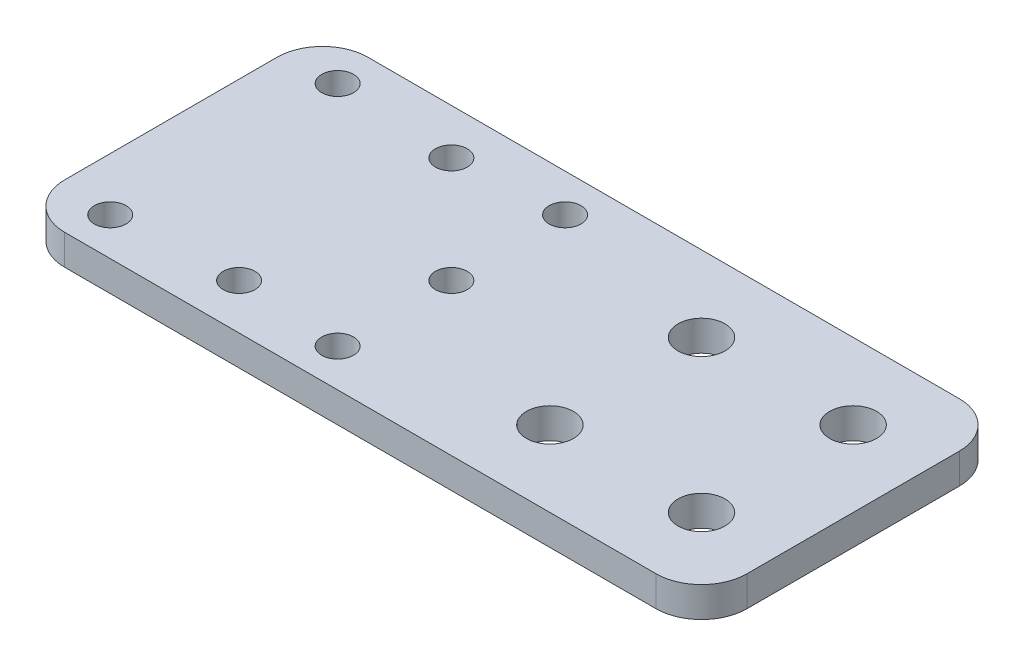
ISO-10303-21;
HEADER;
FILE_DESCRIPTION(('STEP AP214'),'2;1');
FILE_NAME('part.step','',(''),(''),'','','');
FILE_SCHEMA(('AUTOMOTIVE_DESIGN { 1 0 10303 214 1 1 1 1 }'));
ENDSEC;
DATA;
#1=APPLICATION_CONTEXT('core data for automotive mechanical design processes');
#2=APPLICATION_PROTOCOL_DEFINITION('international standard','automotive_design',2000,#1);
#3=PRODUCT_CONTEXT('',#1,'mechanical');
#4=PRODUCT('Part','Part','',(#3));
#5=PRODUCT_RELATED_PRODUCT_CATEGORY('part','',(#4));
#6=PRODUCT_DEFINITION_FORMATION('','',#4);
#7=PRODUCT_DEFINITION_CONTEXT('part definition',#1,'design');
#8=PRODUCT_DEFINITION('design','',#6,#7);
#9=PRODUCT_DEFINITION_SHAPE('','',#8);
#10=(LENGTH_UNIT() NAMED_UNIT(*) SI_UNIT(.MILLI.,.METRE.));
#11=(NAMED_UNIT(*) PLANE_ANGLE_UNIT() SI_UNIT($,.RADIAN.));
#12=(NAMED_UNIT(*) SI_UNIT($,.STERADIAN.) SOLID_ANGLE_UNIT());
#13=UNCERTAINTY_MEASURE_WITH_UNIT(LENGTH_MEASURE(1.E-05),#10,'distance_accuracy_value','');
#14=(GEOMETRIC_REPRESENTATION_CONTEXT(3) GLOBAL_UNCERTAINTY_ASSIGNED_CONTEXT((#13)) GLOBAL_UNIT_ASSIGNED_CONTEXT((#10,
#11,#12)) REPRESENTATION_CONTEXT('',''));
#15=CARTESIAN_POINT('',(0.,0.,0.));
#16=DIRECTION('',(0.,0.,1.));
#17=DIRECTION('',(1.,0.,0.));
#18=AXIS2_PLACEMENT_3D('',#15,#16,#17);
#19=CARTESIAN_POINT('',(0.,2.,0.));
#20=DIRECTION('',(0.,-1.,0.));
#21=DIRECTION('',(0.,0.,-1.));
#22=AXIS2_PLACEMENT_3D('',#19,#20,#21);
#23=PLANE('',#22);
#24=DIRECTION('',(-1.,0.,0.));
#25=VECTOR('',#24,1.);
#26=CARTESIAN_POINT('',(0.,2.,-20.));
#27=LINE('',#26,#25);
#28=CARTESIAN_POINT('',(42.,2.,-20.));
#29=VERTEX_POINT('',#28);
#30=CARTESIAN_POINT('',(3.,2.,-20.));
#31=VERTEX_POINT('',#30);
#32=EDGE_CURVE('E154',#29,#31,#27,.T.);
#33=ORIENTED_EDGE('',*,*,#32,.T.);
#34=CARTESIAN_POINT('',(3.,2.,-17.));
#35=DIRECTION('',(0.,-1.,0.));
#36=DIRECTION('',(0.,0.,-1.));
#37=AXIS2_PLACEMENT_3D('',#34,#35,#36);
#38=CIRCLE('',#37,3.);
#39=CARTESIAN_POINT('',(0.,2.,-17.));
#40=VERTEX_POINT('',#39);
#41=EDGE_CURVE('E184',#31,#40,#38,.F.);
#42=ORIENTED_EDGE('',*,*,#41,.T.);
#43=DIRECTION('',(0.,0.,1.));
#44=VECTOR('',#43,1.);
#45=CARTESIAN_POINT('',(0.,2.,0.));
#46=LINE('',#45,#44);
#47=CARTESIAN_POINT('',(0.,2.,-3.));
#48=VERTEX_POINT('',#47);
#49=EDGE_CURVE('E133',#40,#48,#46,.T.);
#50=ORIENTED_EDGE('',*,*,#49,.T.);
#51=CARTESIAN_POINT('',(3.,2.,-3.));
#52=DIRECTION('',(0.,-1.,0.));
#53=DIRECTION('',(0.,0.,-1.));
#54=AXIS2_PLACEMENT_3D('',#51,#52,#53);
#55=CIRCLE('',#54,3.);
#56=CARTESIAN_POINT('',(3.,2.,0.));
#57=VERTEX_POINT('',#56);
#58=EDGE_CURVE('E176',#48,#57,#55,.F.);
#59=ORIENTED_EDGE('',*,*,#58,.T.);
#60=DIRECTION('',(1.,0.,0.));
#61=VECTOR('',#60,1.);
#62=CARTESIAN_POINT('',(0.,2.,0.));
#63=LINE('',#62,#61);
#64=CARTESIAN_POINT('',(42.,2.,0.));
#65=VERTEX_POINT('',#64);
#66=EDGE_CURVE('E199',#57,#65,#63,.T.);
#67=ORIENTED_EDGE('',*,*,#66,.T.);
#68=CARTESIAN_POINT('',(42.,2.,-3.00000000000001));
#69=DIRECTION('',(0.,-1.,0.));
#70=DIRECTION('',(0.,0.,-1.));
#71=AXIS2_PLACEMENT_3D('',#68,#69,#70);
#72=CIRCLE('',#71,3.);
#73=CARTESIAN_POINT('',(45.,2.,-3.00000000000001));
#74=VERTEX_POINT('',#73);
#75=EDGE_CURVE('E68',#65,#74,#72,.F.);
#76=ORIENTED_EDGE('',*,*,#75,.T.);
#77=DIRECTION('',(0.,0.,-1.));
#78=VECTOR('',#77,1.);
#79=CARTESIAN_POINT('',(45.,2.,0.));
#80=LINE('',#79,#78);
#81=CARTESIAN_POINT('',(45.,2.,-17.));
#82=VERTEX_POINT('',#81);
#83=EDGE_CURVE('E207',#74,#82,#80,.T.);
#84=ORIENTED_EDGE('',*,*,#83,.T.);
#85=CARTESIAN_POINT('',(42.,2.,-17.));
#86=DIRECTION('',(0.,-1.,0.));
#87=DIRECTION('',(0.,0.,-1.));
#88=AXIS2_PLACEMENT_3D('',#85,#86,#87);
#89=CIRCLE('',#88,3.);
#90=EDGE_CURVE('E181',#82,#29,#89,.F.);
#91=ORIENTED_EDGE('',*,*,#90,.T.);
#92=EDGE_LOOP('',(#33,#42,#50,#59,#67,#76,#84,#91));
#93=FACE_BOUND('',#92,.T.);
#94=CARTESIAN_POINT('',(30.,2.,-15.));
#95=DIRECTION('',(0.,1.,0.));
#96=DIRECTION('',(0.,0.,1.));
#97=AXIS2_PLACEMENT_3D('',#94,#95,#96);
#98=CIRCLE('',#97,1.55);
#99=CARTESIAN_POINT('',(30.,2.,-13.45));
#100=VERTEX_POINT('',#99);
#101=EDGE_CURVE('E143',#100,#100,#98,.T.);
#102=ORIENTED_EDGE('',*,*,#101,.F.);
#103=EDGE_LOOP('',(#102));
#104=FACE_BOUND('',#103,.T.);
#105=CARTESIAN_POINT('',(40.,2.,-15.));
#106=DIRECTION('',(0.,1.,0.));
#107=DIRECTION('',(0.,0.,1.));
#108=AXIS2_PLACEMENT_3D('',#105,#106,#107);
#109=CIRCLE('',#108,1.55);
#110=CARTESIAN_POINT('',(40.,2.,-13.45));
#111=VERTEX_POINT('',#110);
#112=EDGE_CURVE('E219',#111,#111,#109,.T.);
#113=ORIENTED_EDGE('',*,*,#112,.F.);
#114=EDGE_LOOP('',(#113));
#115=FACE_BOUND('',#114,.T.);
#116=CARTESIAN_POINT('',(40.,2.,-5.));
#117=DIRECTION('',(0.,1.,0.));
#118=DIRECTION('',(0.,0.,1.));
#119=AXIS2_PLACEMENT_3D('',#116,#117,#118);
#120=CIRCLE('',#119,1.55);
#121=CARTESIAN_POINT('',(40.,2.,-3.45));
#122=VERTEX_POINT('',#121);
#123=EDGE_CURVE('E225',#122,#122,#120,.T.);
#124=ORIENTED_EDGE('',*,*,#123,.F.);
#125=EDGE_LOOP('',(#124));
#126=FACE_BOUND('',#125,.T.);
#127=CARTESIAN_POINT('',(30.,2.,-5.));
#128=DIRECTION('',(0.,1.,0.));
#129=DIRECTION('',(0.,0.,1.));
#130=AXIS2_PLACEMENT_3D('',#127,#128,#129);
#131=CIRCLE('',#130,1.55);
#132=CARTESIAN_POINT('',(30.,2.,-3.45));
#133=VERTEX_POINT('',#132);
#134=EDGE_CURVE('E233',#133,#133,#131,.T.);
#135=ORIENTED_EDGE('',*,*,#134,.F.);
#136=EDGE_LOOP('',(#135));
#137=FACE_BOUND('',#136,.T.);
#138=CARTESIAN_POINT('',(11.5,2.,-17.));
#139=DIRECTION('',(0.,1.,0.));
#140=DIRECTION('',(0.,0.,1.));
#141=AXIS2_PLACEMENT_3D('',#138,#139,#140);
#142=CIRCLE('',#141,1.05);
#143=CARTESIAN_POINT('',(11.5,2.,-15.95));
#144=VERTEX_POINT('',#143);
#145=EDGE_CURVE('E241',#144,#144,#142,.T.);
#146=ORIENTED_EDGE('',*,*,#145,.F.);
#147=EDGE_LOOP('',(#146));
#148=FACE_BOUND('',#147,.T.);
#149=CARTESIAN_POINT('',(18.5,2.,-10.));
#150=DIRECTION('',(0.,1.,0.));
#151=DIRECTION('',(0.,0.,1.));
#152=AXIS2_PLACEMENT_3D('',#149,#150,#151);
#153=CIRCLE('',#152,1.05);
#154=CARTESIAN_POINT('',(18.5,2.,-8.95));
#155=VERTEX_POINT('',#154);
#156=EDGE_CURVE('E249',#155,#155,#153,.T.);
#157=ORIENTED_EDGE('',*,*,#156,.F.);
#158=EDGE_LOOP('',(#157));
#159=FACE_BOUND('',#158,.T.);
#160=CARTESIAN_POINT('',(11.5,2.,-3.));
#161=DIRECTION('',(0.,1.,0.));
#162=DIRECTION('',(0.,0.,1.));
#163=AXIS2_PLACEMENT_3D('',#160,#161,#162);
#164=CIRCLE('',#163,1.05);
#165=CARTESIAN_POINT('',(11.5,2.,-1.95));
#166=VERTEX_POINT('',#165);
#167=EDGE_CURVE('E257',#166,#166,#164,.T.);
#168=ORIENTED_EDGE('',*,*,#167,.F.);
#169=EDGE_LOOP('',(#168));
#170=FACE_BOUND('',#169,.T.);
#171=CARTESIAN_POINT('',(3.5,2.,-17.5));
#172=DIRECTION('',(0.,1.,0.));
#173=DIRECTION('',(0.,0.,1.));
#174=AXIS2_PLACEMENT_3D('',#171,#172,#173);
#175=CIRCLE('',#174,1.05);
#176=CARTESIAN_POINT('',(3.5,2.,-16.45));
#177=VERTEX_POINT('',#176);
#178=EDGE_CURVE('E265',#177,#177,#175,.T.);
#179=ORIENTED_EDGE('',*,*,#178,.F.);
#180=EDGE_LOOP('',(#179));
#181=FACE_BOUND('',#180,.T.);
#182=CARTESIAN_POINT('',(18.5,2.,-17.5));
#183=DIRECTION('',(0.,1.,0.));
#184=DIRECTION('',(0.,0.,1.));
#185=AXIS2_PLACEMENT_3D('',#182,#183,#184);
#186=CIRCLE('',#185,1.05);
#187=CARTESIAN_POINT('',(18.5,2.,-16.45));
#188=VERTEX_POINT('',#187);
#189=EDGE_CURVE('E273',#188,#188,#186,.T.);
#190=ORIENTED_EDGE('',*,*,#189,.F.);
#191=EDGE_LOOP('',(#190));
#192=FACE_BOUND('',#191,.T.);
#193=CARTESIAN_POINT('',(18.5,2.,-2.5));
#194=DIRECTION('',(0.,1.,0.));
#195=DIRECTION('',(0.,0.,1.));
#196=AXIS2_PLACEMENT_3D('',#193,#194,#195);
#197=CIRCLE('',#196,1.05);
#198=CARTESIAN_POINT('',(18.5,2.,-1.45));
#199=VERTEX_POINT('',#198);
#200=EDGE_CURVE('E281',#199,#199,#197,.T.);
#201=ORIENTED_EDGE('',*,*,#200,.F.);
#202=EDGE_LOOP('',(#201));
#203=FACE_BOUND('',#202,.T.);
#204=CARTESIAN_POINT('',(3.5,2.,-2.5));
#205=DIRECTION('',(0.,1.,0.));
#206=DIRECTION('',(0.,0.,1.));
#207=AXIS2_PLACEMENT_3D('',#204,#205,#206);
#208=CIRCLE('',#207,1.05);
#209=CARTESIAN_POINT('',(3.5,2.,-1.45));
#210=VERTEX_POINT('',#209);
#211=EDGE_CURVE('E289',#210,#210,#208,.T.);
#212=ORIENTED_EDGE('',*,*,#211,.F.);
#213=EDGE_LOOP('',(#212));
#214=FACE_BOUND('',#213,.T.);
#215=ADVANCED_FACE('F45',(#93,#104,#115,#126,#137,#148,#159,#170,#181,#192,#203,#214),#23,.F.);
#216=CARTESIAN_POINT('',(0.,0.,0.));
#217=DIRECTION('',(0.,-1.,0.));
#218=DIRECTION('',(0.,0.,-1.));
#219=AXIS2_PLACEMENT_3D('',#216,#217,#218);
#220=PLANE('',#219);
#221=CARTESIAN_POINT('',(18.5,0.,-2.5));
#222=DIRECTION('',(0.,1.,0.));
#223=DIRECTION('',(0.,0.,1.));
#224=AXIS2_PLACEMENT_3D('',#221,#222,#223);
#225=CIRCLE('',#224,1.05);
#226=CARTESIAN_POINT('',(18.5,0.,-1.45));
#227=VERTEX_POINT('',#226);
#228=EDGE_CURVE('E285',#227,#227,#225,.T.);
#229=ORIENTED_EDGE('',*,*,#228,.T.);
#230=EDGE_LOOP('',(#229));
#231=FACE_BOUND('',#230,.T.);
#232=CARTESIAN_POINT('',(3.5,0.,-17.5));
#233=DIRECTION('',(0.,1.,0.));
#234=DIRECTION('',(0.,0.,1.));
#235=AXIS2_PLACEMENT_3D('',#232,#233,#234);
#236=CIRCLE('',#235,1.05);
#237=CARTESIAN_POINT('',(3.5,0.,-16.45));
#238=VERTEX_POINT('',#237);
#239=EDGE_CURVE('E269',#238,#238,#236,.T.);
#240=ORIENTED_EDGE('',*,*,#239,.T.);
#241=EDGE_LOOP('',(#240));
#242=FACE_BOUND('',#241,.T.);
#243=CARTESIAN_POINT('',(18.5,0.,-10.));
#244=DIRECTION('',(0.,1.,0.));
#245=DIRECTION('',(0.,0.,1.));
#246=AXIS2_PLACEMENT_3D('',#243,#244,#245);
#247=CIRCLE('',#246,1.05);
#248=CARTESIAN_POINT('',(18.5,0.,-8.95));
#249=VERTEX_POINT('',#248);
#250=EDGE_CURVE('E253',#249,#249,#247,.T.);
#251=ORIENTED_EDGE('',*,*,#250,.T.);
#252=EDGE_LOOP('',(#251));
#253=FACE_BOUND('',#252,.T.);
#254=CARTESIAN_POINT('',(30.,0.,-5.));
#255=DIRECTION('',(0.,1.,0.));
#256=DIRECTION('',(0.,0.,1.));
#257=AXIS2_PLACEMENT_3D('',#254,#255,#256);
#258=CIRCLE('',#257,1.55);
#259=CARTESIAN_POINT('',(30.,0.,-3.45));
#260=VERTEX_POINT('',#259);
#261=EDGE_CURVE('E237',#260,#260,#258,.T.);
#262=ORIENTED_EDGE('',*,*,#261,.T.);
#263=EDGE_LOOP('',(#262));
#264=FACE_BOUND('',#263,.T.);
#265=CARTESIAN_POINT('',(40.,0.,-15.));
#266=DIRECTION('',(0.,1.,0.));
#267=DIRECTION('',(0.,0.,1.));
#268=AXIS2_PLACEMENT_3D('',#265,#266,#267);
#269=CIRCLE('',#268,1.55);
#270=CARTESIAN_POINT('',(40.,0.,-13.45));
#271=VERTEX_POINT('',#270);
#272=EDGE_CURVE('E221',#271,#271,#269,.T.);
#273=ORIENTED_EDGE('',*,*,#272,.T.);
#274=EDGE_LOOP('',(#273));
#275=FACE_BOUND('',#274,.T.);
#276=DIRECTION('',(0.,0.,1.));
#277=VECTOR('',#276,1.);
#278=CARTESIAN_POINT('',(0.,0.,0.));
#279=LINE('',#278,#277);
#280=CARTESIAN_POINT('',(0.,0.,-17.));
#281=VERTEX_POINT('',#280);
#282=CARTESIAN_POINT('',(0.,0.,-3.));
#283=VERTEX_POINT('',#282);
#284=EDGE_CURVE('E130',#281,#283,#279,.T.);
#285=ORIENTED_EDGE('',*,*,#284,.F.);
#286=CARTESIAN_POINT('',(3.,0.,-17.));
#287=DIRECTION('',(0.,-1.,0.));
#288=DIRECTION('',(0.,0.,-1.));
#289=AXIS2_PLACEMENT_3D('',#286,#287,#288);
#290=CIRCLE('',#289,3.);
#291=CARTESIAN_POINT('',(3.,0.,-20.));
#292=VERTEX_POINT('',#291);
#293=EDGE_CURVE('E112',#281,#292,#290,.T.);
#294=ORIENTED_EDGE('',*,*,#293,.T.);
#295=DIRECTION('',(-1.,0.,0.));
#296=VECTOR('',#295,1.);
#297=CARTESIAN_POINT('',(0.,0.,-20.));
#298=LINE('',#297,#296);
#299=CARTESIAN_POINT('',(42.,0.,-20.));
#300=VERTEX_POINT('',#299);
#301=EDGE_CURVE('E159',#300,#292,#298,.T.);
#302=ORIENTED_EDGE('',*,*,#301,.F.);
#303=CARTESIAN_POINT('',(42.,0.,-17.));
#304=DIRECTION('',(0.,-1.,0.));
#305=DIRECTION('',(0.,0.,-1.));
#306=AXIS2_PLACEMENT_3D('',#303,#304,#305);
#307=CIRCLE('',#306,3.);
#308=CARTESIAN_POINT('',(45.,0.,-17.));
#309=VERTEX_POINT('',#308);
#310=EDGE_CURVE('E124',#300,#309,#307,.T.);
#311=ORIENTED_EDGE('',*,*,#310,.T.);
#312=DIRECTION('',(0.,0.,-1.));
#313=VECTOR('',#312,1.);
#314=CARTESIAN_POINT('',(45.,0.,0.));
#315=LINE('',#314,#313);
#316=CARTESIAN_POINT('',(45.,0.,-3.00000000000001));
#317=VERTEX_POINT('',#316);
#318=EDGE_CURVE('E148',#317,#309,#315,.T.);
#319=ORIENTED_EDGE('',*,*,#318,.F.);
#320=CARTESIAN_POINT('',(42.,0.,-3.00000000000001));
#321=DIRECTION('',(0.,-1.,0.));
#322=DIRECTION('',(0.,0.,-1.));
#323=AXIS2_PLACEMENT_3D('',#320,#321,#322);
#324=CIRCLE('',#323,3.);
#325=CARTESIAN_POINT('',(42.,0.,0.));
#326=VERTEX_POINT('',#325);
#327=EDGE_CURVE('E166',#317,#326,#324,.T.);
#328=ORIENTED_EDGE('',*,*,#327,.T.);
#329=DIRECTION('',(1.,0.,0.));
#330=VECTOR('',#329,1.);
#331=CARTESIAN_POINT('',(0.,0.,0.));
#332=LINE('',#331,#330);
#333=CARTESIAN_POINT('',(3.,0.,0.));
#334=VERTEX_POINT('',#333);
#335=EDGE_CURVE('E142',#334,#326,#332,.T.);
#336=ORIENTED_EDGE('',*,*,#335,.F.);
#337=CARTESIAN_POINT('',(3.,0.,-3.));
#338=DIRECTION('',(0.,-1.,0.));
#339=DIRECTION('',(0.,0.,-1.));
#340=AXIS2_PLACEMENT_3D('',#337,#338,#339);
#341=CIRCLE('',#340,3.);
#342=EDGE_CURVE('E135',#334,#283,#341,.T.);
#343=ORIENTED_EDGE('',*,*,#342,.T.);
#344=EDGE_LOOP('',(#285,#294,#302,#311,#319,#328,#336,#343));
#345=FACE_BOUND('',#344,.T.);
#346=CARTESIAN_POINT('',(30.,0.,-15.));
#347=DIRECTION('',(0.,1.,0.));
#348=DIRECTION('',(0.,0.,1.));
#349=AXIS2_PLACEMENT_3D('',#346,#347,#348);
#350=CIRCLE('',#349,1.55);
#351=CARTESIAN_POINT('',(30.,0.,-13.45));
#352=VERTEX_POINT('',#351);
#353=EDGE_CURVE('E151',#352,#352,#350,.T.);
#354=ORIENTED_EDGE('',*,*,#353,.T.);
#355=EDGE_LOOP('',(#354));
#356=FACE_BOUND('',#355,.T.);
#357=CARTESIAN_POINT('',(40.,0.,-5.));
#358=DIRECTION('',(0.,1.,0.));
#359=DIRECTION('',(0.,0.,1.));
#360=AXIS2_PLACEMENT_3D('',#357,#358,#359);
#361=CIRCLE('',#360,1.55);
#362=CARTESIAN_POINT('',(40.,0.,-3.45));
#363=VERTEX_POINT('',#362);
#364=EDGE_CURVE('E229',#363,#363,#361,.T.);
#365=ORIENTED_EDGE('',*,*,#364,.T.);
#366=EDGE_LOOP('',(#365));
#367=FACE_BOUND('',#366,.T.);
#368=CARTESIAN_POINT('',(11.5,0.,-17.));
#369=DIRECTION('',(0.,1.,0.));
#370=DIRECTION('',(0.,0.,1.));
#371=AXIS2_PLACEMENT_3D('',#368,#369,#370);
#372=CIRCLE('',#371,1.05);
#373=CARTESIAN_POINT('',(11.5,0.,-15.95));
#374=VERTEX_POINT('',#373);
#375=EDGE_CURVE('E245',#374,#374,#372,.T.);
#376=ORIENTED_EDGE('',*,*,#375,.T.);
#377=EDGE_LOOP('',(#376));
#378=FACE_BOUND('',#377,.T.);
#379=CARTESIAN_POINT('',(11.5,0.,-3.));
#380=DIRECTION('',(0.,1.,0.));
#381=DIRECTION('',(0.,0.,1.));
#382=AXIS2_PLACEMENT_3D('',#379,#380,#381);
#383=CIRCLE('',#382,1.05);
#384=CARTESIAN_POINT('',(11.5,0.,-1.95));
#385=VERTEX_POINT('',#384);
#386=EDGE_CURVE('E261',#385,#385,#383,.T.);
#387=ORIENTED_EDGE('',*,*,#386,.T.);
#388=EDGE_LOOP('',(#387));
#389=FACE_BOUND('',#388,.T.);
#390=CARTESIAN_POINT('',(18.5,0.,-17.5));
#391=DIRECTION('',(0.,1.,0.));
#392=DIRECTION('',(0.,0.,1.));
#393=AXIS2_PLACEMENT_3D('',#390,#391,#392);
#394=CIRCLE('',#393,1.05);
#395=CARTESIAN_POINT('',(18.5,0.,-16.45));
#396=VERTEX_POINT('',#395);
#397=EDGE_CURVE('E277',#396,#396,#394,.T.);
#398=ORIENTED_EDGE('',*,*,#397,.T.);
#399=EDGE_LOOP('',(#398));
#400=FACE_BOUND('',#399,.T.);
#401=CARTESIAN_POINT('',(3.5,0.,-2.5));
#402=DIRECTION('',(0.,1.,0.));
#403=DIRECTION('',(0.,0.,1.));
#404=AXIS2_PLACEMENT_3D('',#401,#402,#403);
#405=CIRCLE('',#404,1.05);
#406=CARTESIAN_POINT('',(3.5,0.,-1.45));
#407=VERTEX_POINT('',#406);
#408=EDGE_CURVE('E293',#407,#407,#405,.T.);
#409=ORIENTED_EDGE('',*,*,#408,.T.);
#410=EDGE_LOOP('',(#409));
#411=FACE_BOUND('',#410,.T.);
#412=ADVANCED_FACE('F138',(#231,#242,#253,#264,#275,#345,#356,#367,#378,#389,#400,#411),#220,.T.);
#413=CARTESIAN_POINT('',(0.,2.,0.));
#414=DIRECTION('',(1.,0.,0.));
#415=DIRECTION('',(0.,0.,-1.));
#416=AXIS2_PLACEMENT_3D('',#413,#414,#415);
#417=PLANE('',#416);
#418=ORIENTED_EDGE('',*,*,#49,.F.);
#419=DIRECTION('',(0.,-1.,0.));
#420=VECTOR('',#419,1.);
#421=CARTESIAN_POINT('',(0.,2.,-17.));
#422=LINE('',#421,#420);
#423=EDGE_CURVE('E116',#40,#281,#422,.T.);
#424=ORIENTED_EDGE('',*,*,#423,.T.);
#425=ORIENTED_EDGE('',*,*,#284,.T.);
#426=DIRECTION('',(0.,-1.,0.));
#427=VECTOR('',#426,1.);
#428=CARTESIAN_POINT('',(0.,2.,-3.));
#429=LINE('',#428,#427);
#430=EDGE_CURVE('E136',#283,#48,#429,.F.);
#431=ORIENTED_EDGE('',*,*,#430,.T.);
#432=EDGE_LOOP('',(#418,#424,#425,#431));
#433=FACE_BOUND('',#432,.T.);
#434=ADVANCED_FACE('F129',(#433),#417,.F.);
#435=CARTESIAN_POINT('',(0.,2.,0.));
#436=DIRECTION('',(0.,0.,-1.));
#437=DIRECTION('',(-1.,0.,0.));
#438=AXIS2_PLACEMENT_3D('',#435,#436,#437);
#439=PLANE('',#438);
#440=ORIENTED_EDGE('',*,*,#335,.T.);
#441=DIRECTION('',(0.,-1.,0.));
#442=VECTOR('',#441,1.);
#443=CARTESIAN_POINT('',(42.,2.,0.));
#444=LINE('',#443,#442);
#445=EDGE_CURVE('E11',#326,#65,#444,.F.);
#446=ORIENTED_EDGE('',*,*,#445,.T.);
#447=ORIENTED_EDGE('',*,*,#66,.F.);
#448=DIRECTION('',(0.,-1.,0.));
#449=VECTOR('',#448,1.);
#450=CARTESIAN_POINT('',(3.,2.,0.));
#451=LINE('',#450,#449);
#452=EDGE_CURVE('E54',#57,#334,#451,.T.);
#453=ORIENTED_EDGE('',*,*,#452,.T.);
#454=EDGE_LOOP('',(#440,#446,#447,#453));
#455=FACE_BOUND('',#454,.T.);
#456=ADVANCED_FACE('F197',(#455),#439,.F.);
#457=CARTESIAN_POINT('',(45.,2.,0.));
#458=DIRECTION('',(-1.,0.,0.));
#459=DIRECTION('',(0.,0.,1.));
#460=AXIS2_PLACEMENT_3D('',#457,#458,#459);
#461=PLANE('',#460);
#462=ORIENTED_EDGE('',*,*,#318,.T.);
#463=DIRECTION('',(0.,-1.,0.));
#464=VECTOR('',#463,1.);
#465=CARTESIAN_POINT('',(45.,2.,-17.));
#466=LINE('',#465,#464);
#467=EDGE_CURVE('E61',#309,#82,#466,.F.);
#468=ORIENTED_EDGE('',*,*,#467,.T.);
#469=ORIENTED_EDGE('',*,*,#83,.F.);
#470=DIRECTION('',(0.,-1.,0.));
#471=VECTOR('',#470,1.);
#472=CARTESIAN_POINT('',(45.,2.,-3.00000000000001));
#473=LINE('',#472,#471);
#474=EDGE_CURVE('E187',#74,#317,#473,.T.);
#475=ORIENTED_EDGE('',*,*,#474,.T.);
#476=EDGE_LOOP('',(#462,#468,#469,#475));
#477=FACE_BOUND('',#476,.T.);
#478=ADVANCED_FACE('F206',(#477),#461,.F.);
#479=CARTESIAN_POINT('',(0.,2.,-20.));
#480=DIRECTION('',(0.,0.,1.));
#481=DIRECTION('',(1.,0.,0.));
#482=AXIS2_PLACEMENT_3D('',#479,#480,#481);
#483=PLANE('',#482);
#484=ORIENTED_EDGE('',*,*,#301,.T.);
#485=DIRECTION('',(0.,-1.,0.));
#486=VECTOR('',#485,1.);
#487=CARTESIAN_POINT('',(3.,2.,-20.));
#488=LINE('',#487,#486);
#489=EDGE_CURVE('E117',#292,#31,#488,.F.);
#490=ORIENTED_EDGE('',*,*,#489,.T.);
#491=ORIENTED_EDGE('',*,*,#32,.F.);
#492=DIRECTION('',(0.,-1.,0.));
#493=VECTOR('',#492,1.);
#494=CARTESIAN_POINT('',(42.,2.,-20.));
#495=LINE('',#494,#493);
#496=EDGE_CURVE('E123',#29,#300,#495,.T.);
#497=ORIENTED_EDGE('',*,*,#496,.T.);
#498=EDGE_LOOP('',(#484,#490,#491,#497));
#499=FACE_BOUND('',#498,.T.);
#500=ADVANCED_FACE('F317',(#499),#483,.F.);
#501=CARTESIAN_POINT('',(30.,2.,-15.));
#502=DIRECTION('',(0.,-1.,0.));
#503=DIRECTION('',(0.,0.,-1.));
#504=AXIS2_PLACEMENT_3D('',#501,#502,#503);
#505=CYLINDRICAL_SURFACE('',#504,1.55);
#506=ORIENTED_EDGE('',*,*,#101,.T.);
#507=EDGE_LOOP('',(#506));
#508=FACE_BOUND('',#507,.T.);
#509=ORIENTED_EDGE('',*,*,#353,.F.);
#510=EDGE_LOOP('',(#509));
#511=FACE_BOUND('',#510,.T.);
#512=ADVANCED_FACE('F314',(#508,#511),#505,.F.);
#513=CARTESIAN_POINT('',(40.,2.,-15.));
#514=DIRECTION('',(0.,-1.,0.));
#515=DIRECTION('',(0.,0.,-1.));
#516=AXIS2_PLACEMENT_3D('',#513,#514,#515);
#517=CYLINDRICAL_SURFACE('',#516,1.55);
#518=ORIENTED_EDGE('',*,*,#112,.T.);
#519=EDGE_LOOP('',(#518));
#520=FACE_BOUND('',#519,.T.);
#521=ORIENTED_EDGE('',*,*,#272,.F.);
#522=EDGE_LOOP('',(#521));
#523=FACE_BOUND('',#522,.T.);
#524=ADVANCED_FACE('F444',(#520,#523),#517,.F.);
#525=CARTESIAN_POINT('',(40.,2.,-5.));
#526=DIRECTION('',(0.,-1.,0.));
#527=DIRECTION('',(0.,0.,-1.));
#528=AXIS2_PLACEMENT_3D('',#525,#526,#527);
#529=CYLINDRICAL_SURFACE('',#528,1.55);
#530=ORIENTED_EDGE('',*,*,#123,.T.);
#531=EDGE_LOOP('',(#530));
#532=FACE_BOUND('',#531,.T.);
#533=ORIENTED_EDGE('',*,*,#364,.F.);
#534=EDGE_LOOP('',(#533));
#535=FACE_BOUND('',#534,.T.);
#536=ADVANCED_FACE('F434',(#532,#535),#529,.F.);
#537=CARTESIAN_POINT('',(30.,2.,-5.));
#538=DIRECTION('',(0.,-1.,0.));
#539=DIRECTION('',(0.,0.,-1.));
#540=AXIS2_PLACEMENT_3D('',#537,#538,#539);
#541=CYLINDRICAL_SURFACE('',#540,1.55);
#542=ORIENTED_EDGE('',*,*,#134,.T.);
#543=EDGE_LOOP('',(#542));
#544=FACE_BOUND('',#543,.T.);
#545=ORIENTED_EDGE('',*,*,#261,.F.);
#546=EDGE_LOOP('',(#545));
#547=FACE_BOUND('',#546,.T.);
#548=ADVANCED_FACE('F424',(#544,#547),#541,.F.);
#549=CARTESIAN_POINT('',(11.5,2.,-17.));
#550=DIRECTION('',(0.,-1.,0.));
#551=DIRECTION('',(0.,0.,-1.));
#552=AXIS2_PLACEMENT_3D('',#549,#550,#551);
#553=CYLINDRICAL_SURFACE('',#552,1.05);
#554=ORIENTED_EDGE('',*,*,#145,.T.);
#555=EDGE_LOOP('',(#554));
#556=FACE_BOUND('',#555,.T.);
#557=ORIENTED_EDGE('',*,*,#375,.F.);
#558=EDGE_LOOP('',(#557));
#559=FACE_BOUND('',#558,.T.);
#560=ADVANCED_FACE('F414',(#556,#559),#553,.F.);
#561=CARTESIAN_POINT('',(18.5,2.,-10.));
#562=DIRECTION('',(0.,-1.,0.));
#563=DIRECTION('',(0.,0.,-1.));
#564=AXIS2_PLACEMENT_3D('',#561,#562,#563);
#565=CYLINDRICAL_SURFACE('',#564,1.05);
#566=ORIENTED_EDGE('',*,*,#156,.T.);
#567=EDGE_LOOP('',(#566));
#568=FACE_BOUND('',#567,.T.);
#569=ORIENTED_EDGE('',*,*,#250,.F.);
#570=EDGE_LOOP('',(#569));
#571=FACE_BOUND('',#570,.T.);
#572=ADVANCED_FACE('F404',(#568,#571),#565,.F.);
#573=CARTESIAN_POINT('',(11.5,2.,-3.));
#574=DIRECTION('',(0.,-1.,0.));
#575=DIRECTION('',(0.,0.,-1.));
#576=AXIS2_PLACEMENT_3D('',#573,#574,#575);
#577=CYLINDRICAL_SURFACE('',#576,1.05);
#578=ORIENTED_EDGE('',*,*,#167,.T.);
#579=EDGE_LOOP('',(#578));
#580=FACE_BOUND('',#579,.T.);
#581=ORIENTED_EDGE('',*,*,#386,.F.);
#582=EDGE_LOOP('',(#581));
#583=FACE_BOUND('',#582,.T.);
#584=ADVANCED_FACE('F394',(#580,#583),#577,.F.);
#585=CARTESIAN_POINT('',(3.5,2.,-17.5));
#586=DIRECTION('',(0.,-1.,0.));
#587=DIRECTION('',(0.,0.,-1.));
#588=AXIS2_PLACEMENT_3D('',#585,#586,#587);
#589=CYLINDRICAL_SURFACE('',#588,1.05);
#590=ORIENTED_EDGE('',*,*,#178,.T.);
#591=EDGE_LOOP('',(#590));
#592=FACE_BOUND('',#591,.T.);
#593=ORIENTED_EDGE('',*,*,#239,.F.);
#594=EDGE_LOOP('',(#593));
#595=FACE_BOUND('',#594,.T.);
#596=ADVANCED_FACE('F384',(#592,#595),#589,.F.);
#597=CARTESIAN_POINT('',(18.5,2.,-17.5));
#598=DIRECTION('',(0.,-1.,0.));
#599=DIRECTION('',(0.,0.,-1.));
#600=AXIS2_PLACEMENT_3D('',#597,#598,#599);
#601=CYLINDRICAL_SURFACE('',#600,1.05);
#602=ORIENTED_EDGE('',*,*,#189,.T.);
#603=EDGE_LOOP('',(#602));
#604=FACE_BOUND('',#603,.T.);
#605=ORIENTED_EDGE('',*,*,#397,.F.);
#606=EDGE_LOOP('',(#605));
#607=FACE_BOUND('',#606,.T.);
#608=ADVANCED_FACE('F374',(#604,#607),#601,.F.);
#609=CARTESIAN_POINT('',(18.5,2.,-2.5));
#610=DIRECTION('',(0.,-1.,0.));
#611=DIRECTION('',(0.,0.,-1.));
#612=AXIS2_PLACEMENT_3D('',#609,#610,#611);
#613=CYLINDRICAL_SURFACE('',#612,1.05);
#614=ORIENTED_EDGE('',*,*,#200,.T.);
#615=EDGE_LOOP('',(#614));
#616=FACE_BOUND('',#615,.T.);
#617=ORIENTED_EDGE('',*,*,#228,.F.);
#618=EDGE_LOOP('',(#617));
#619=FACE_BOUND('',#618,.T.);
#620=ADVANCED_FACE('F365',(#616,#619),#613,.F.);
#621=CARTESIAN_POINT('',(3.5,2.,-2.5));
#622=DIRECTION('',(0.,-1.,0.));
#623=DIRECTION('',(0.,0.,-1.));
#624=AXIS2_PLACEMENT_3D('',#621,#622,#623);
#625=CYLINDRICAL_SURFACE('',#624,1.05);
#626=ORIENTED_EDGE('',*,*,#211,.T.);
#627=EDGE_LOOP('',(#626));
#628=FACE_BOUND('',#627,.T.);
#629=ORIENTED_EDGE('',*,*,#408,.F.);
#630=EDGE_LOOP('',(#629));
#631=FACE_BOUND('',#630,.T.);
#632=ADVANCED_FACE('F301',(#628,#631),#625,.F.);
#633=CARTESIAN_POINT('',(3.,2.,-17.));
#634=DIRECTION('',(0.,-1.,0.));
#635=DIRECTION('',(0.,0.,-1.));
#636=AXIS2_PLACEMENT_3D('',#633,#634,#635);
#637=CYLINDRICAL_SURFACE('',#636,3.);
#638=ORIENTED_EDGE('',*,*,#41,.F.);
#639=ORIENTED_EDGE('',*,*,#489,.F.);
#640=ORIENTED_EDGE('',*,*,#293,.F.);
#641=ORIENTED_EDGE('',*,*,#423,.F.);
#642=EDGE_LOOP('',(#638,#639,#640,#641));
#643=FACE_BOUND('',#642,.T.);
#644=ADVANCED_FACE('F115',(#643),#637,.T.);
#645=CARTESIAN_POINT('',(42.,2.,-17.));
#646=DIRECTION('',(0.,-1.,0.));
#647=DIRECTION('',(0.,0.,-1.));
#648=AXIS2_PLACEMENT_3D('',#645,#646,#647);
#649=CYLINDRICAL_SURFACE('',#648,3.);
#650=ORIENTED_EDGE('',*,*,#90,.F.);
#651=ORIENTED_EDGE('',*,*,#467,.F.);
#652=ORIENTED_EDGE('',*,*,#310,.F.);
#653=ORIENTED_EDGE('',*,*,#496,.F.);
#654=EDGE_LOOP('',(#650,#651,#652,#653));
#655=FACE_BOUND('',#654,.T.);
#656=ADVANCED_FACE('F329',(#655),#649,.T.);
#657=CARTESIAN_POINT('',(42.,2.,-3.00000000000001));
#658=DIRECTION('',(0.,-1.,0.));
#659=DIRECTION('',(0.,0.,-1.));
#660=AXIS2_PLACEMENT_3D('',#657,#658,#659);
#661=CYLINDRICAL_SURFACE('',#660,3.);
#662=ORIENTED_EDGE('',*,*,#75,.F.);
#663=ORIENTED_EDGE('',*,*,#445,.F.);
#664=ORIENTED_EDGE('',*,*,#327,.F.);
#665=ORIENTED_EDGE('',*,*,#474,.F.);
#666=EDGE_LOOP('',(#662,#663,#664,#665));
#667=FACE_BOUND('',#666,.T.);
#668=ADVANCED_FACE('F205',(#667),#661,.T.);
#669=CARTESIAN_POINT('',(3.,2.,-3.));
#670=DIRECTION('',(0.,-1.,0.));
#671=DIRECTION('',(0.,0.,-1.));
#672=AXIS2_PLACEMENT_3D('',#669,#670,#671);
#673=CYLINDRICAL_SURFACE('',#672,3.);
#674=ORIENTED_EDGE('',*,*,#58,.F.);
#675=ORIENTED_EDGE('',*,*,#430,.F.);
#676=ORIENTED_EDGE('',*,*,#342,.F.);
#677=ORIENTED_EDGE('',*,*,#452,.F.);
#678=EDGE_LOOP('',(#674,#675,#676,#677));
#679=FACE_BOUND('',#678,.T.);
#680=ADVANCED_FACE('F47',(#679),#673,.T.);
#681=CLOSED_SHELL('',(#215,#412,#434,#456,#478,#500,#512,#524,#536,#548,#560,#572,#584,#596,
#608,#620,#632,#644,#656,#668,#680));
#682=MANIFOLD_SOLID_BREP('B2',#681);
#683=ADVANCED_BREP_SHAPE_REPRESENTATION('',(#18,#682),#14);
#684=SHAPE_DEFINITION_REPRESENTATION(#9,#683);
ENDSEC;
END-ISO-10303-21;
